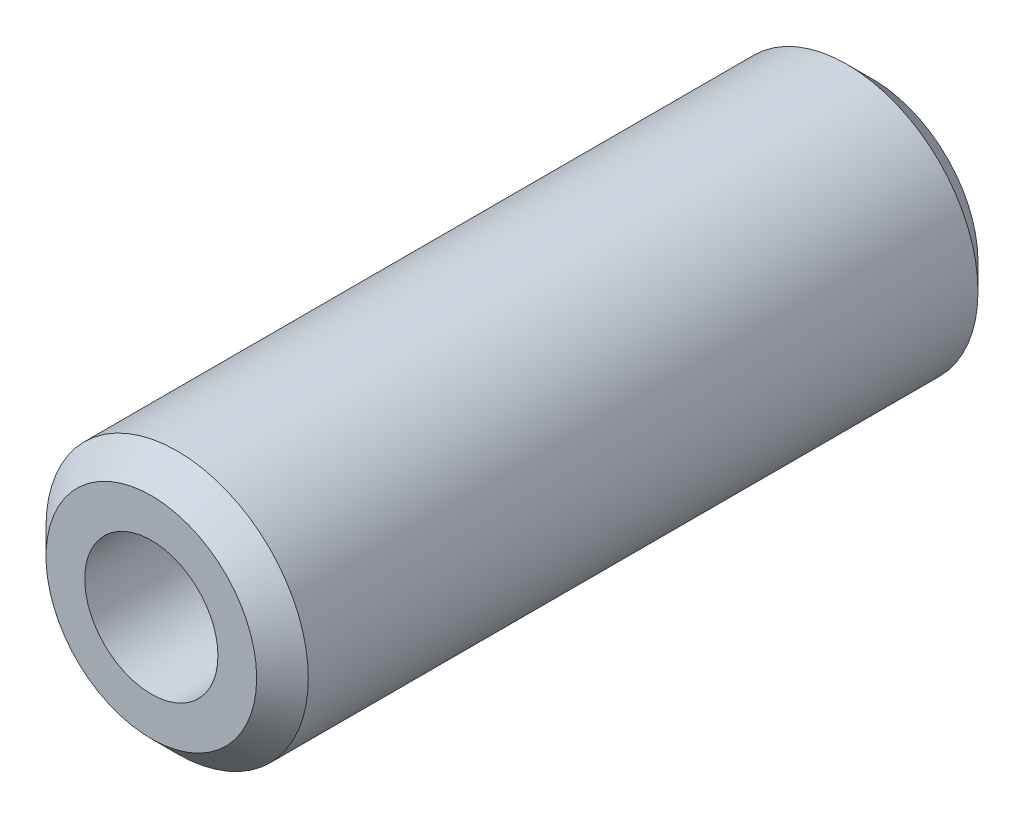
ISO-10303-21;
HEADER;
FILE_DESCRIPTION(('STEP AP214'),'2;1');
FILE_NAME('part.step','',(''),(''),'','','');
FILE_SCHEMA(('AUTOMOTIVE_DESIGN { 1 0 10303 214 1 1 1 1 }'));
ENDSEC;
DATA;
#1=APPLICATION_CONTEXT('core data for automotive mechanical design processes');
#2=APPLICATION_PROTOCOL_DEFINITION('international standard','automotive_design',2000,#1);
#3=PRODUCT_CONTEXT('',#1,'mechanical');
#4=PRODUCT('Part','Part','',(#3));
#5=PRODUCT_RELATED_PRODUCT_CATEGORY('part','',(#4));
#6=PRODUCT_DEFINITION_FORMATION('','',#4);
#7=PRODUCT_DEFINITION_CONTEXT('part definition',#1,'design');
#8=PRODUCT_DEFINITION('design','',#6,#7);
#9=PRODUCT_DEFINITION_SHAPE('','',#8);
#10=(LENGTH_UNIT() NAMED_UNIT(*) SI_UNIT(.MILLI.,.METRE.));
#11=(NAMED_UNIT(*) PLANE_ANGLE_UNIT() SI_UNIT($,.RADIAN.));
#12=(NAMED_UNIT(*) SI_UNIT($,.STERADIAN.) SOLID_ANGLE_UNIT());
#13=UNCERTAINTY_MEASURE_WITH_UNIT(LENGTH_MEASURE(1.E-05),#10,'distance_accuracy_value','');
#14=(GEOMETRIC_REPRESENTATION_CONTEXT(3) GLOBAL_UNCERTAINTY_ASSIGNED_CONTEXT((#13)) GLOBAL_UNIT_ASSIGNED_CONTEXT((#10,
#11,#12)) REPRESENTATION_CONTEXT('',''));
#15=CARTESIAN_POINT('',(0.,0.,0.));
#16=DIRECTION('',(0.,0.,1.));
#17=DIRECTION('',(1.,0.,0.));
#18=AXIS2_PLACEMENT_3D('',#15,#16,#17);
#19=CARTESIAN_POINT('',(0.,0.,34.925));
#20=DIRECTION('',(0.,0.,1.));
#21=DIRECTION('',(1.,0.,0.));
#22=AXIS2_PLACEMENT_3D('',#19,#20,#21);
#23=PLANE('',#22);
#24=CARTESIAN_POINT('',(0.,0.,34.925));
#25=DIRECTION('',(0.,0.,1.));
#26=DIRECTION('',(1.,0.,0.));
#27=AXIS2_PLACEMENT_3D('',#24,#25,#26);
#28=CIRCLE('',#27,10.2);
#29=CARTESIAN_POINT('',(10.2,0.,34.925));
#30=VERTEX_POINT('',#29);
#31=EDGE_CURVE('E10',#30,#30,#28,.T.);
#32=ORIENTED_EDGE('',*,*,#31,.T.);
#33=EDGE_LOOP('',(#32));
#34=FACE_BOUND('',#33,.T.);
#35=CARTESIAN_POINT('',(0.,0.,34.925));
#36=DIRECTION('',(0.,0.,1.));
#37=DIRECTION('',(1.,0.,0.));
#38=AXIS2_PLACEMENT_3D('',#35,#36,#37);
#39=CIRCLE('',#38,6.45);
#40=CARTESIAN_POINT('',(6.45,0.,34.925));
#41=VERTEX_POINT('',#40);
#42=EDGE_CURVE('E62',#41,#41,#39,.T.);
#43=ORIENTED_EDGE('',*,*,#42,.F.);
#44=EDGE_LOOP('',(#43));
#45=FACE_BOUND('',#44,.T.);
#46=ADVANCED_FACE('F41',(#34,#45),#23,.T.);
#47=CARTESIAN_POINT('',(0.,0.,-34.925));
#48=DIRECTION('',(0.,0.,1.));
#49=DIRECTION('',(1.,0.,0.));
#50=AXIS2_PLACEMENT_3D('',#47,#48,#49);
#51=PLANE('',#50);
#52=CARTESIAN_POINT('',(0.,0.,-34.925));
#53=DIRECTION('',(0.,0.,1.));
#54=DIRECTION('',(1.,0.,0.));
#55=AXIS2_PLACEMENT_3D('',#52,#53,#54);
#56=CIRCLE('',#55,10.2);
#57=CARTESIAN_POINT('',(10.2,0.,-34.925));
#58=VERTEX_POINT('',#57);
#59=EDGE_CURVE('E49',#58,#58,#56,.F.);
#60=ORIENTED_EDGE('',*,*,#59,.T.);
#61=EDGE_LOOP('',(#60));
#62=FACE_BOUND('',#61,.T.);
#63=CARTESIAN_POINT('',(0.,0.,-34.925));
#64=DIRECTION('',(0.,0.,1.));
#65=DIRECTION('',(1.,0.,0.));
#66=AXIS2_PLACEMENT_3D('',#63,#64,#65);
#67=CIRCLE('',#66,6.45);
#68=CARTESIAN_POINT('',(6.45,0.,-34.925));
#69=VERTEX_POINT('',#68);
#70=EDGE_CURVE('E63',#69,#69,#67,.T.);
#71=ORIENTED_EDGE('',*,*,#70,.T.);
#72=EDGE_LOOP('',(#71));
#73=FACE_BOUND('',#72,.T.);
#74=ADVANCED_FACE('F73',(#62,#73),#51,.F.);
#75=CARTESIAN_POINT('',(0.,0.,34.925));
#76=DIRECTION('',(0.,0.,-1.));
#77=DIRECTION('',(-1.,0.,0.));
#78=AXIS2_PLACEMENT_3D('',#75,#76,#77);
#79=CYLINDRICAL_SURFACE('',#78,12.7);
#80=CARTESIAN_POINT('',(0.,0.,-32.425));
#81=DIRECTION('',(0.,0.,1.));
#82=DIRECTION('',(1.,0.,0.));
#83=AXIS2_PLACEMENT_3D('',#80,#81,#82);
#84=CIRCLE('',#83,12.7);
#85=CARTESIAN_POINT('',(12.7,0.,-32.425));
#86=VERTEX_POINT('',#85);
#87=EDGE_CURVE('E53',#86,#86,#84,.T.);
#88=ORIENTED_EDGE('',*,*,#87,.T.);
#89=EDGE_LOOP('',(#88));
#90=FACE_BOUND('',#89,.T.);
#91=CARTESIAN_POINT('',(0.,0.,32.425));
#92=DIRECTION('',(0.,0.,1.));
#93=DIRECTION('',(1.,0.,0.));
#94=AXIS2_PLACEMENT_3D('',#91,#92,#93);
#95=CIRCLE('',#94,12.7);
#96=CARTESIAN_POINT('',(12.7,0.,32.425));
#97=VERTEX_POINT('',#96);
#98=EDGE_CURVE('E57',#97,#97,#95,.F.);
#99=ORIENTED_EDGE('',*,*,#98,.T.);
#100=EDGE_LOOP('',(#99));
#101=FACE_BOUND('',#100,.T.);
#102=ADVANCED_FACE('F78',(#90,#101),#79,.T.);
#103=CARTESIAN_POINT('',(0.,0.,34.925));
#104=DIRECTION('',(0.,0.,-1.));
#105=DIRECTION('',(-1.,0.,0.));
#106=AXIS2_PLACEMENT_3D('',#103,#104,#105);
#107=CYLINDRICAL_SURFACE('',#106,6.45);
#108=ORIENTED_EDGE('',*,*,#42,.T.);
#109=EDGE_LOOP('',(#108));
#110=FACE_BOUND('',#109,.T.);
#111=ORIENTED_EDGE('',*,*,#70,.F.);
#112=EDGE_LOOP('',(#111));
#113=FACE_BOUND('',#112,.T.);
#114=ADVANCED_FACE('F69',(#110,#113),#107,.F.);
#115=CARTESIAN_POINT('',(0.,0.,-32.425));
#116=DIRECTION('',(0.,0.,1.));
#117=DIRECTION('',(1.,0.,0.));
#118=AXIS2_PLACEMENT_3D('',#115,#116,#117);
#119=CONICAL_SURFACE('',#118,12.7,0.785398163397448);
#120=ORIENTED_EDGE('',*,*,#59,.F.);
#121=EDGE_LOOP('',(#120));
#122=FACE_BOUND('',#121,.T.);
#123=ORIENTED_EDGE('',*,*,#87,.F.);
#124=EDGE_LOOP('',(#123));
#125=FACE_BOUND('',#124,.T.);
#126=ADVANCED_FACE('F85',(#122,#125),#119,.T.);
#127=CARTESIAN_POINT('',(0.,0.,34.925));
#128=DIRECTION('',(0.,0.,-1.));
#129=DIRECTION('',(-1.,0.,0.));
#130=AXIS2_PLACEMENT_3D('',#127,#128,#129);
#131=CONICAL_SURFACE('',#130,10.2,0.785398163397448);
#132=ORIENTED_EDGE('',*,*,#98,.F.);
#133=EDGE_LOOP('',(#132));
#134=FACE_BOUND('',#133,.T.);
#135=ORIENTED_EDGE('',*,*,#31,.F.);
#136=EDGE_LOOP('',(#135));
#137=FACE_BOUND('',#136,.T.);
#138=ADVANCED_FACE('F44',(#134,#137),#131,.T.);
#139=CLOSED_SHELL('',(#46,#74,#102,#114,#126,#138));
#140=MANIFOLD_SOLID_BREP('B2',#139);
#141=ADVANCED_BREP_SHAPE_REPRESENTATION('',(#18,#140),#14);
#142=SHAPE_DEFINITION_REPRESENTATION(#9,#141);
ENDSEC;
END-ISO-10303-21;
